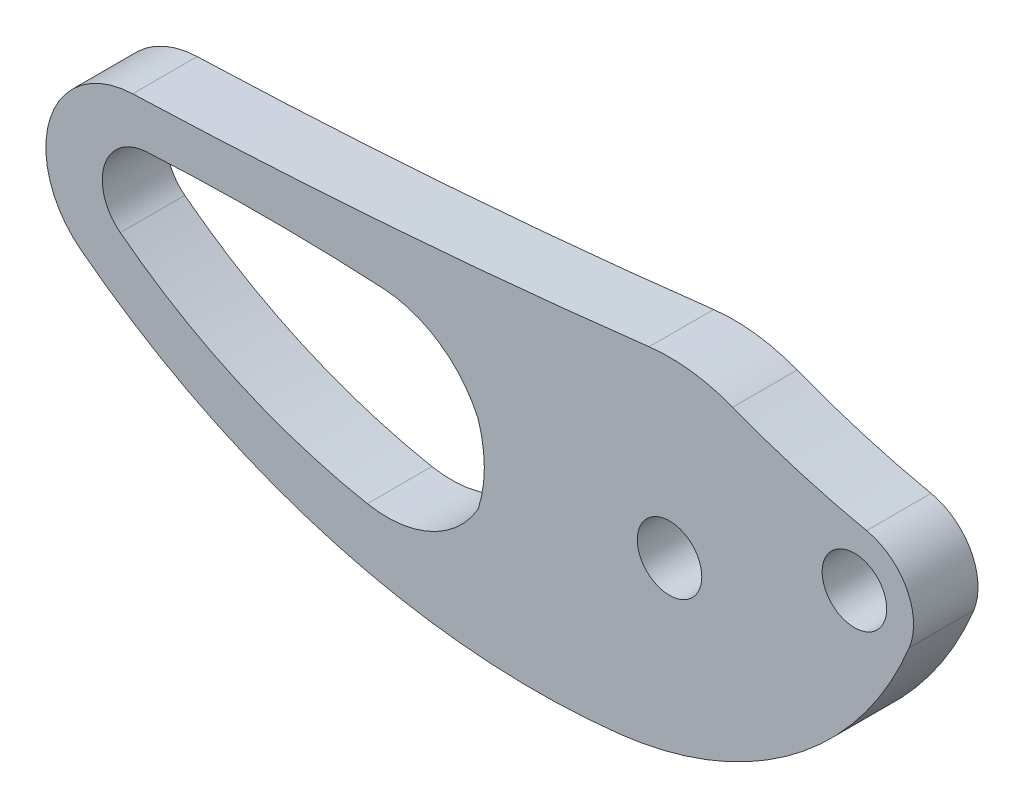
ISO-10303-21;
HEADER;
FILE_DESCRIPTION(('STEP AP214'),'2;1');
FILE_NAME('part.step','',(''),(''),'','','');
FILE_SCHEMA(('AUTOMOTIVE_DESIGN { 1 0 10303 214 1 1 1 1 }'));
ENDSEC;
DATA;
#1=APPLICATION_CONTEXT('core data for automotive mechanical design processes');
#2=APPLICATION_PROTOCOL_DEFINITION('international standard','automotive_design',2000,#1);
#3=PRODUCT_CONTEXT('',#1,'mechanical');
#4=PRODUCT('Part','Part','',(#3));
#5=PRODUCT_RELATED_PRODUCT_CATEGORY('part','',(#4));
#6=PRODUCT_DEFINITION_FORMATION('','',#4);
#7=PRODUCT_DEFINITION_CONTEXT('part definition',#1,'design');
#8=PRODUCT_DEFINITION('design','',#6,#7);
#9=PRODUCT_DEFINITION_SHAPE('','',#8);
#10=(LENGTH_UNIT() NAMED_UNIT(*) SI_UNIT(.MILLI.,.METRE.));
#11=(NAMED_UNIT(*) PLANE_ANGLE_UNIT() SI_UNIT($,.RADIAN.));
#12=(NAMED_UNIT(*) SI_UNIT($,.STERADIAN.) SOLID_ANGLE_UNIT());
#13=UNCERTAINTY_MEASURE_WITH_UNIT(LENGTH_MEASURE(1.E-05),#10,'distance_accuracy_value','');
#14=(GEOMETRIC_REPRESENTATION_CONTEXT(3) GLOBAL_UNCERTAINTY_ASSIGNED_CONTEXT((#13)) GLOBAL_UNIT_ASSIGNED_CONTEXT((#10,
#11,#12)) REPRESENTATION_CONTEXT('',''));
#15=CARTESIAN_POINT('',(0.,0.,0.));
#16=DIRECTION('',(0.,0.,1.));
#17=DIRECTION('',(1.,0.,0.));
#18=AXIS2_PLACEMENT_3D('',#15,#16,#17);
#19=CARTESIAN_POINT('',(-15.5308841395196,14.1350917098286,3.));
#20=DIRECTION('',(0.,0.,1.));
#21=DIRECTION('',(1.,0.,0.));
#22=AXIS2_PLACEMENT_3D('',#19,#20,#21);
#23=PLANE('',#22);
#24=CARTESIAN_POINT('',(0.,0.,3.));
#25=DIRECTION('',(0.,0.,1.));
#26=DIRECTION('',(1.,0.,0.));
#27=AXIS2_PLACEMENT_3D('',#24,#25,#26);
#28=CIRCLE('',#27,1.5);
#29=CARTESIAN_POINT('',(1.5,0.,3.));
#30=VERTEX_POINT('',#29);
#31=EDGE_CURVE('E193',#30,#30,#28,.T.);
#32=ORIENTED_EDGE('',*,*,#31,.F.);
#33=EDGE_LOOP('',(#32));
#34=FACE_BOUND('',#33,.T.);
#35=CARTESIAN_POINT('',(-24.8319884955234,2.03954888143739,3.));
#36=DIRECTION('',(0.,0.,1.));
#37=DIRECTION('',(1.,0.,0.));
#38=AXIS2_PLACEMENT_3D('',#35,#36,#37);
#39=CIRCLE('',#38,4.18039425639633);
#40=CARTESIAN_POINT('',(-24.9740478743966,6.21752868892633,3.));
#41=VERTEX_POINT('',#40);
#42=CARTESIAN_POINT('',(-27.380276013909,-1.27435016086185,3.));
#43=VERTEX_POINT('',#42);
#44=EDGE_CURVE('E199',#41,#43,#39,.T.);
#45=ORIENTED_EDGE('',*,*,#44,.T.);
#46=CARTESIAN_POINT('',(-6.22977978351571,26.2306345382198,3.));
#47=DIRECTION('',(0.,0.,1.));
#48=DIRECTION('',(1.,0.,0.));
#49=AXIS2_PLACEMENT_3D('',#46,#47,#48);
#50=CIRCLE('',#49,34.6967963087169);
#51=CARTESIAN_POINT('',(-2.3390606895117,-8.24732913454005,3.));
#52=VERTEX_POINT('',#51);
#53=EDGE_CURVE('E202',#43,#52,#50,.T.);
#54=ORIENTED_EDGE('',*,*,#53,.T.);
#55=CARTESIAN_POINT('',(-4.1973686650616,8.22023722679113,3.));
#56=DIRECTION('',(0.,0.,1.));
#57=DIRECTION('',(1.,0.,0.));
#58=AXIS2_PLACEMENT_3D('',#55,#56,#57);
#59=CIRCLE('',#58,16.5720864829037);
#60=CARTESIAN_POINT('',(11.147191657554,1.96096259609702,3.));
#61=VERTEX_POINT('',#60);
#62=EDGE_CURVE('E205',#52,#61,#59,.T.);
#63=ORIENTED_EDGE('',*,*,#62,.T.);
#64=CARTESIAN_POINT('',(8.6,3.,3.));
#65=DIRECTION('',(0.,0.,1.));
#66=DIRECTION('',(1.,0.,0.));
#67=AXIS2_PLACEMENT_3D('',#64,#65,#66);
#68=CIRCLE('',#67,2.75096057169527);
#69=CARTESIAN_POINT('',(9.16632252846627,5.69203693525433,3.));
#70=VERTEX_POINT('',#69);
#71=EDGE_CURVE('E207',#61,#70,#68,.T.);
#72=ORIENTED_EDGE('',*,*,#71,.T.);
#73=CARTESIAN_POINT('',(17.3476646448691,44.5823760092716,3.));
#74=DIRECTION('',(0.,0.,-1.));
#75=DIRECTION('',(-1.,0.,0.));
#76=AXIS2_PLACEMENT_3D('',#73,#74,#75);
#77=CIRCLE('',#76,39.7415756119163);
#78=CARTESIAN_POINT('',(2.93620994119707,7.54586962109196,3.));
#79=VERTEX_POINT('',#78);
#80=EDGE_CURVE('E209',#70,#79,#77,.T.);
#81=ORIENTED_EDGE('',*,*,#80,.T.);
#82=CARTESIAN_POINT('',(0.,0.,3.));
#83=DIRECTION('',(0.,0.,1.));
#84=DIRECTION('',(1.,0.,0.));
#85=AXIS2_PLACEMENT_3D('',#82,#83,#84);
#86=CIRCLE('',#85,8.09700420879869);
#87=CARTESIAN_POINT('',(-0.949475558181056,8.04114253832877,3.));
#88=VERTEX_POINT('',#87);
#89=EDGE_CURVE('E211',#79,#88,#86,.T.);
#90=ORIENTED_EDGE('',*,*,#89,.T.);
#91=CARTESIAN_POINT('',(-34.7772091161292,294.529430672017,3.));
#92=DIRECTION('',(0.,0.,-1.));
#93=DIRECTION('',(-1.,0.,0.));
#94=AXIS2_PLACEMENT_3D('',#91,#92,#93);
#95=CIRCLE('',#94,288.478517043191);
#96=EDGE_CURVE('E213',#88,#41,#95,.T.);
#97=ORIENTED_EDGE('',*,*,#96,.T.);
#98=EDGE_LOOP('',(#45,#54,#63,#72,#81,#90,#97));
#99=FACE_BOUND('',#98,.T.);
#100=CARTESIAN_POINT('',(8.6,3.,3.));
#101=DIRECTION('',(0.,0.,1.));
#102=DIRECTION('',(1.,0.,0.));
#103=AXIS2_PLACEMENT_3D('',#100,#101,#102);
#104=CIRCLE('',#103,1.5);
#105=CARTESIAN_POINT('',(10.1,3.,3.));
#106=VERTEX_POINT('',#105);
#107=EDGE_CURVE('E187',#106,#106,#104,.T.);
#108=ORIENTED_EDGE('',*,*,#107,.F.);
#109=EDGE_LOOP('',(#108));
#110=FACE_BOUND('',#109,.T.);
#111=CARTESIAN_POINT('',(-8.96168684271906,21.8324207585978,3.));
#112=DIRECTION('',(0.,0.,1.));
#113=DIRECTION('',(1.,0.,0.));
#114=AXIS2_PLACEMENT_3D('',#111,#112,#113);
#115=CIRCLE('',#114,27.1503349913436);
#116=CARTESIAN_POINT('',(-25.5492022366017,0.338351269553009,3.));
#117=VERTEX_POINT('',#116);
#118=CARTESIAN_POINT('',(-14.0560528446288,-4.83568988277995,3.));
#119=VERTEX_POINT('',#118);
#120=EDGE_CURVE('E144',#117,#119,#115,.T.);
#121=ORIENTED_EDGE('',*,*,#120,.F.);
#122=CARTESIAN_POINT('',(-24.2307407016769,2.04681110680852,3.));
#123=DIRECTION('',(0.,0.,1.));
#124=DIRECTION('',(-1.,0.,0.));
#125=AXIS2_PLACEMENT_3D('',#122,#123,#124);
#126=CIRCLE('',#125,2.15804908067248);
#127=CARTESIAN_POINT('',(-24.3493638937052,4.20159749364697,3.));
#128=VERTEX_POINT('',#127);
#129=EDGE_CURVE('E136',#128,#117,#126,.T.);
#130=ORIENTED_EDGE('',*,*,#129,.F.);
#131=CARTESIAN_POINT('',(-18.8042959294308,-96.524379941401,3.));
#132=DIRECTION('',(0.,0.,1.));
#133=DIRECTION('',(-1.,0.,0.));
#134=AXIS2_PLACEMENT_3D('',#131,#132,#133);
#135=CIRCLE('',#134,100.8784927969);
#136=CARTESIAN_POINT('',(-13.3345642891084,4.205716577748,3.));
#137=VERTEX_POINT('',#136);
#138=EDGE_CURVE('E165',#137,#128,#135,.T.);
#139=ORIENTED_EDGE('',*,*,#138,.F.);
#140=CARTESIAN_POINT('',(-13.614511928909,-0.949774519757408,3.));
#141=DIRECTION('',(0.,0.,1.));
#142=DIRECTION('',(1.,0.,0.));
#143=AXIS2_PLACEMENT_3D('',#140,#141,#142);
#144=CIRCLE('',#143,5.16308620279457);
#145=CARTESIAN_POINT('',(-8.90463517045772,1.16553161829632,3.));
#146=VERTEX_POINT('',#145);
#147=EDGE_CURVE('E163',#146,#137,#144,.T.);
#148=ORIENTED_EDGE('',*,*,#147,.F.);
#149=CARTESIAN_POINT('',(-14.5098051441842,-0.657235742021626,3.));
#150=DIRECTION('',(0.,0.,1.));
#151=DIRECTION('',(1.,0.,0.));
#152=AXIS2_PLACEMENT_3D('',#149,#150,#151);
#153=CIRCLE('',#152,5.89409970090478);
#154=CARTESIAN_POINT('',(-8.90463517045773,-2.48000310233957,3.));
#155=VERTEX_POINT('',#154);
#156=EDGE_CURVE('E159',#155,#146,#153,.T.);
#157=ORIENTED_EDGE('',*,*,#156,.F.);
#158=CARTESIAN_POINT('',(-13.1384094101785,-0.0319877871549591,3.));
#159=DIRECTION('',(0.,0.,1.));
#160=DIRECTION('',(1.,0.,0.));
#161=AXIS2_PLACEMENT_3D('',#158,#159,#160);
#162=CIRCLE('',#161,4.89056472161465);
#163=EDGE_CURVE('E157',#119,#155,#162,.T.);
#164=ORIENTED_EDGE('',*,*,#163,.F.);
#165=EDGE_LOOP('',(#121,#130,#139,#148,#157,#164));
#166=FACE_BOUND('',#165,.T.);
#167=ADVANCED_FACE('F41',(#34,#99,#110,#166),#23,.T.);
#168=CARTESIAN_POINT('',(-15.5308841395196,14.1350917098286,0.));
#169=DIRECTION('',(0.,0.,1.));
#170=DIRECTION('',(1.,0.,0.));
#171=AXIS2_PLACEMENT_3D('',#168,#169,#170);
#172=PLANE('',#171);
#173=CARTESIAN_POINT('',(8.6,3.,0.));
#174=DIRECTION('',(0.,0.,1.));
#175=DIRECTION('',(1.,0.,0.));
#176=AXIS2_PLACEMENT_3D('',#173,#174,#175);
#177=CIRCLE('',#176,1.5);
#178=CARTESIAN_POINT('',(10.1,3.,0.));
#179=VERTEX_POINT('',#178);
#180=EDGE_CURVE('E152',#179,#179,#177,.T.);
#181=ORIENTED_EDGE('',*,*,#180,.T.);
#182=EDGE_LOOP('',(#181));
#183=FACE_BOUND('',#182,.T.);
#184=CARTESIAN_POINT('',(0.,0.,0.));
#185=DIRECTION('',(0.,0.,1.));
#186=DIRECTION('',(1.,0.,0.));
#187=AXIS2_PLACEMENT_3D('',#184,#185,#186);
#188=CIRCLE('',#187,1.5);
#189=CARTESIAN_POINT('',(1.5,0.,0.));
#190=VERTEX_POINT('',#189);
#191=EDGE_CURVE('E190',#190,#190,#188,.T.);
#192=ORIENTED_EDGE('',*,*,#191,.T.);
#193=EDGE_LOOP('',(#192));
#194=FACE_BOUND('',#193,.T.);
#195=CARTESIAN_POINT('',(-24.8319884955234,2.03954888143739,0.));
#196=DIRECTION('',(0.,0.,1.));
#197=DIRECTION('',(1.,0.,0.));
#198=AXIS2_PLACEMENT_3D('',#195,#196,#197);
#199=CIRCLE('',#198,4.18039425639633);
#200=CARTESIAN_POINT('',(-24.9740478743966,6.21752868892633,0.));
#201=VERTEX_POINT('',#200);
#202=CARTESIAN_POINT('',(-27.380276013909,-1.27435016086185,0.));
#203=VERTEX_POINT('',#202);
#204=EDGE_CURVE('E196',#201,#203,#199,.T.);
#205=ORIENTED_EDGE('',*,*,#204,.F.);
#206=CARTESIAN_POINT('',(-34.7772091161292,294.529430672017,0.));
#207=DIRECTION('',(0.,0.,-1.));
#208=DIRECTION('',(-1.,0.,0.));
#209=AXIS2_PLACEMENT_3D('',#206,#207,#208);
#210=CIRCLE('',#209,288.478517043191);
#211=CARTESIAN_POINT('',(-0.949475558181056,8.04114253832877,0.));
#212=VERTEX_POINT('',#211);
#213=EDGE_CURVE('E203',#212,#201,#210,.T.);
#214=ORIENTED_EDGE('',*,*,#213,.F.);
#215=CARTESIAN_POINT('',(0.,0.,0.));
#216=DIRECTION('',(0.,0.,1.));
#217=DIRECTION('',(1.,0.,0.));
#218=AXIS2_PLACEMENT_3D('',#215,#216,#217);
#219=CIRCLE('',#218,8.09700420879869);
#220=CARTESIAN_POINT('',(2.93620994119707,7.54586962109196,0.));
#221=VERTEX_POINT('',#220);
#222=EDGE_CURVE('E226',#221,#212,#219,.T.);
#223=ORIENTED_EDGE('',*,*,#222,.F.);
#224=CARTESIAN_POINT('',(17.3476646448691,44.5823760092716,0.));
#225=DIRECTION('',(0.,0.,-1.));
#226=DIRECTION('',(-1.,0.,0.));
#227=AXIS2_PLACEMENT_3D('',#224,#225,#226);
#228=CIRCLE('',#227,39.7415756119163);
#229=CARTESIAN_POINT('',(9.16632252846627,5.69203693525433,0.));
#230=VERTEX_POINT('',#229);
#231=EDGE_CURVE('E224',#230,#221,#228,.T.);
#232=ORIENTED_EDGE('',*,*,#231,.F.);
#233=CARTESIAN_POINT('',(8.6,3.,0.));
#234=DIRECTION('',(0.,0.,1.));
#235=DIRECTION('',(1.,0.,0.));
#236=AXIS2_PLACEMENT_3D('',#233,#234,#235);
#237=CIRCLE('',#236,2.75096057169527);
#238=CARTESIAN_POINT('',(11.147191657554,1.96096259609702,0.));
#239=VERTEX_POINT('',#238);
#240=EDGE_CURVE('E222',#239,#230,#237,.T.);
#241=ORIENTED_EDGE('',*,*,#240,.F.);
#242=CARTESIAN_POINT('',(-4.1973686650616,8.22023722679113,0.));
#243=DIRECTION('',(0.,0.,1.));
#244=DIRECTION('',(1.,0.,0.));
#245=AXIS2_PLACEMENT_3D('',#242,#243,#244);
#246=CIRCLE('',#245,16.5720864829037);
#247=CARTESIAN_POINT('',(-2.3390606895117,-8.24732913454005,0.));
#248=VERTEX_POINT('',#247);
#249=EDGE_CURVE('E220',#248,#239,#246,.T.);
#250=ORIENTED_EDGE('',*,*,#249,.F.);
#251=CARTESIAN_POINT('',(-6.22977978351571,26.2306345382198,0.));
#252=DIRECTION('',(0.,0.,1.));
#253=DIRECTION('',(1.,0.,0.));
#254=AXIS2_PLACEMENT_3D('',#251,#252,#253);
#255=CIRCLE('',#254,34.6967963087169);
#256=EDGE_CURVE('E218',#203,#248,#255,.T.);
#257=ORIENTED_EDGE('',*,*,#256,.F.);
#258=EDGE_LOOP('',(#205,#214,#223,#232,#241,#250,#257));
#259=FACE_BOUND('',#258,.T.);
#260=CARTESIAN_POINT('',(-24.2307407016769,2.04681110680852,0.));
#261=DIRECTION('',(0.,0.,1.));
#262=DIRECTION('',(-1.,0.,0.));
#263=AXIS2_PLACEMENT_3D('',#260,#261,#262);
#264=CIRCLE('',#263,2.15804908067248);
#265=CARTESIAN_POINT('',(-24.3493638937052,4.20159749364697,0.));
#266=VERTEX_POINT('',#265);
#267=CARTESIAN_POINT('',(-25.5492022366017,0.338351269553009,0.));
#268=VERTEX_POINT('',#267);
#269=EDGE_CURVE('E64',#266,#268,#264,.T.);
#270=ORIENTED_EDGE('',*,*,#269,.T.);
#271=CARTESIAN_POINT('',(-8.96168684271906,21.8324207585978,0.));
#272=DIRECTION('',(0.,0.,1.));
#273=DIRECTION('',(1.,0.,0.));
#274=AXIS2_PLACEMENT_3D('',#271,#272,#273);
#275=CIRCLE('',#274,27.1503349913436);
#276=CARTESIAN_POINT('',(-14.0560528446288,-4.83568988277995,0.));
#277=VERTEX_POINT('',#276);
#278=EDGE_CURVE('E151',#268,#277,#275,.T.);
#279=ORIENTED_EDGE('',*,*,#278,.T.);
#280=CARTESIAN_POINT('',(-13.1384094101785,-0.0319877871549591,0.));
#281=DIRECTION('',(0.,0.,1.));
#282=DIRECTION('',(1.,0.,0.));
#283=AXIS2_PLACEMENT_3D('',#280,#281,#282);
#284=CIRCLE('',#283,4.89056472161465);
#285=CARTESIAN_POINT('',(-8.90463517045773,-2.48000310233957,0.));
#286=VERTEX_POINT('',#285);
#287=EDGE_CURVE('E169',#277,#286,#284,.T.);
#288=ORIENTED_EDGE('',*,*,#287,.T.);
#289=CARTESIAN_POINT('',(-14.5098051441842,-0.657235742021626,0.));
#290=DIRECTION('',(0.,0.,1.));
#291=DIRECTION('',(1.,0.,0.));
#292=AXIS2_PLACEMENT_3D('',#289,#290,#291);
#293=CIRCLE('',#292,5.89409970090478);
#294=CARTESIAN_POINT('',(-8.90463517045772,1.16553161829632,0.));
#295=VERTEX_POINT('',#294);
#296=EDGE_CURVE('E172',#286,#295,#293,.T.);
#297=ORIENTED_EDGE('',*,*,#296,.T.);
#298=CARTESIAN_POINT('',(-13.614511928909,-0.949774519757408,0.));
#299=DIRECTION('',(0.,0.,1.));
#300=DIRECTION('',(1.,0.,0.));
#301=AXIS2_PLACEMENT_3D('',#298,#299,#300);
#302=CIRCLE('',#301,5.16308620279457);
#303=CARTESIAN_POINT('',(-13.3345642891084,4.20571657774802,0.));
#304=VERTEX_POINT('',#303);
#305=EDGE_CURVE('E175',#295,#304,#302,.T.);
#306=ORIENTED_EDGE('',*,*,#305,.T.);
#307=CARTESIAN_POINT('',(-18.8042959294308,-96.524379941401,0.));
#308=DIRECTION('',(0.,0.,1.));
#309=DIRECTION('',(-1.,0.,0.));
#310=AXIS2_PLACEMENT_3D('',#307,#308,#309);
#311=CIRCLE('',#310,100.8784927969);
#312=EDGE_CURVE('E145',#304,#266,#311,.T.);
#313=ORIENTED_EDGE('',*,*,#312,.T.);
#314=EDGE_LOOP('',(#270,#279,#288,#297,#306,#313));
#315=FACE_BOUND('',#314,.T.);
#316=ADVANCED_FACE('F253',(#183,#194,#259,#315),#172,.F.);
#317=CARTESIAN_POINT('',(-24.8319884955234,2.03954888143739,3.));
#318=DIRECTION('',(0.,0.,-1.));
#319=DIRECTION('',(-1.,0.,0.));
#320=AXIS2_PLACEMENT_3D('',#317,#318,#319);
#321=CYLINDRICAL_SURFACE('',#320,4.18039425639633);
#322=ORIENTED_EDGE('',*,*,#204,.T.);
#323=DIRECTION('',(0.,0.,-1.));
#324=VECTOR('',#323,1.);
#325=CARTESIAN_POINT('',(-27.380276013909,-1.27435016086185,3.));
#326=LINE('',#325,#324);
#327=EDGE_CURVE('E11',#43,#203,#326,.T.);
#328=ORIENTED_EDGE('',*,*,#327,.F.);
#329=ORIENTED_EDGE('',*,*,#44,.F.);
#330=DIRECTION('',(0.,0.,-1.));
#331=VECTOR('',#330,1.);
#332=CARTESIAN_POINT('',(-24.9740478743966,6.21752868892633,3.));
#333=LINE('',#332,#331);
#334=EDGE_CURVE('E215',#41,#201,#333,.T.);
#335=ORIENTED_EDGE('',*,*,#334,.T.);
#336=EDGE_LOOP('',(#322,#328,#329,#335));
#337=FACE_BOUND('',#336,.T.);
#338=ADVANCED_FACE('F43',(#337),#321,.T.);
#339=CARTESIAN_POINT('',(-6.22977978351571,26.2306345382198,3.));
#340=DIRECTION('',(0.,0.,-1.));
#341=DIRECTION('',(-1.,0.,0.));
#342=AXIS2_PLACEMENT_3D('',#339,#340,#341);
#343=CYLINDRICAL_SURFACE('',#342,34.6967963087169);
#344=ORIENTED_EDGE('',*,*,#256,.T.);
#345=DIRECTION('',(0.,0.,-1.));
#346=VECTOR('',#345,1.);
#347=CARTESIAN_POINT('',(-2.3390606895117,-8.24732913454005,3.));
#348=LINE('',#347,#346);
#349=EDGE_CURVE('E49',#52,#248,#348,.T.);
#350=ORIENTED_EDGE('',*,*,#349,.F.);
#351=ORIENTED_EDGE('',*,*,#53,.F.);
#352=ORIENTED_EDGE('',*,*,#327,.T.);
#353=EDGE_LOOP('',(#344,#350,#351,#352));
#354=FACE_BOUND('',#353,.T.);
#355=ADVANCED_FACE('F271',(#354),#343,.T.);
#356=CARTESIAN_POINT('',(-4.1973686650616,8.22023722679113,3.));
#357=DIRECTION('',(0.,0.,-1.));
#358=DIRECTION('',(-1.,0.,0.));
#359=AXIS2_PLACEMENT_3D('',#356,#357,#358);
#360=CYLINDRICAL_SURFACE('',#359,16.5720864829037);
#361=ORIENTED_EDGE('',*,*,#249,.T.);
#362=DIRECTION('',(0.,0.,-1.));
#363=VECTOR('',#362,1.);
#364=CARTESIAN_POINT('',(11.147191657554,1.96096259609702,3.));
#365=LINE('',#364,#363);
#366=EDGE_CURVE('E240',#61,#239,#365,.T.);
#367=ORIENTED_EDGE('',*,*,#366,.F.);
#368=ORIENTED_EDGE('',*,*,#62,.F.);
#369=ORIENTED_EDGE('',*,*,#349,.T.);
#370=EDGE_LOOP('',(#361,#367,#368,#369));
#371=FACE_BOUND('',#370,.T.);
#372=ADVANCED_FACE('F247',(#371),#360,.T.);
#373=CARTESIAN_POINT('',(8.6,3.,3.));
#374=DIRECTION('',(0.,0.,-1.));
#375=DIRECTION('',(-1.,0.,0.));
#376=AXIS2_PLACEMENT_3D('',#373,#374,#375);
#377=CYLINDRICAL_SURFACE('',#376,2.75096057169527);
#378=ORIENTED_EDGE('',*,*,#240,.T.);
#379=DIRECTION('',(0.,0.,-1.));
#380=VECTOR('',#379,1.);
#381=CARTESIAN_POINT('',(9.16632252846627,5.69203693525433,3.));
#382=LINE('',#381,#380);
#383=EDGE_CURVE('E237',#70,#230,#382,.T.);
#384=ORIENTED_EDGE('',*,*,#383,.F.);
#385=ORIENTED_EDGE('',*,*,#71,.F.);
#386=ORIENTED_EDGE('',*,*,#366,.T.);
#387=EDGE_LOOP('',(#378,#384,#385,#386));
#388=FACE_BOUND('',#387,.T.);
#389=ADVANCED_FACE('F259',(#388),#377,.T.);
#390=CARTESIAN_POINT('',(17.3476646448691,44.5823760092716,3.));
#391=DIRECTION('',(0.,0.,-1.));
#392=DIRECTION('',(-1.,0.,0.));
#393=AXIS2_PLACEMENT_3D('',#390,#391,#392);
#394=CYLINDRICAL_SURFACE('',#393,39.7415756119163);
#395=ORIENTED_EDGE('',*,*,#231,.T.);
#396=DIRECTION('',(0.,0.,-1.));
#397=VECTOR('',#396,1.);
#398=CARTESIAN_POINT('',(2.93620994119707,7.54586962109196,3.));
#399=LINE('',#398,#397);
#400=EDGE_CURVE('E234',#79,#221,#399,.T.);
#401=ORIENTED_EDGE('',*,*,#400,.F.);
#402=ORIENTED_EDGE('',*,*,#80,.F.);
#403=ORIENTED_EDGE('',*,*,#383,.T.);
#404=EDGE_LOOP('',(#395,#401,#402,#403));
#405=FACE_BOUND('',#404,.T.);
#406=ADVANCED_FACE('F263',(#405),#394,.F.);
#407=CARTESIAN_POINT('',(0.,0.,3.));
#408=DIRECTION('',(0.,0.,-1.));
#409=DIRECTION('',(-1.,0.,0.));
#410=AXIS2_PLACEMENT_3D('',#407,#408,#409);
#411=CYLINDRICAL_SURFACE('',#410,8.09700420879869);
#412=ORIENTED_EDGE('',*,*,#222,.T.);
#413=DIRECTION('',(0.,0.,-1.));
#414=VECTOR('',#413,1.);
#415=CARTESIAN_POINT('',(-0.949475558181056,8.04114253832877,3.));
#416=LINE('',#415,#414);
#417=EDGE_CURVE('E231',#88,#212,#416,.T.);
#418=ORIENTED_EDGE('',*,*,#417,.F.);
#419=ORIENTED_EDGE('',*,*,#89,.F.);
#420=ORIENTED_EDGE('',*,*,#400,.T.);
#421=EDGE_LOOP('',(#412,#418,#419,#420));
#422=FACE_BOUND('',#421,.T.);
#423=ADVANCED_FACE('F279',(#422),#411,.T.);
#424=CARTESIAN_POINT('',(-34.7772091161292,294.529430672017,3.));
#425=DIRECTION('',(0.,0.,-1.));
#426=DIRECTION('',(-1.,0.,0.));
#427=AXIS2_PLACEMENT_3D('',#424,#425,#426);
#428=CYLINDRICAL_SURFACE('',#427,288.478517043191);
#429=ORIENTED_EDGE('',*,*,#213,.T.);
#430=ORIENTED_EDGE('',*,*,#334,.F.);
#431=ORIENTED_EDGE('',*,*,#96,.F.);
#432=ORIENTED_EDGE('',*,*,#417,.T.);
#433=EDGE_LOOP('',(#429,#430,#431,#432));
#434=FACE_BOUND('',#433,.T.);
#435=ADVANCED_FACE('F276',(#434),#428,.F.);
#436=CARTESIAN_POINT('',(0.,0.,3.));
#437=DIRECTION('',(0.,0.,-1.));
#438=DIRECTION('',(-1.,0.,0.));
#439=AXIS2_PLACEMENT_3D('',#436,#437,#438);
#440=CYLINDRICAL_SURFACE('',#439,1.5);
#441=ORIENTED_EDGE('',*,*,#31,.T.);
#442=EDGE_LOOP('',(#441));
#443=FACE_BOUND('',#442,.T.);
#444=ORIENTED_EDGE('',*,*,#191,.F.);
#445=EDGE_LOOP('',(#444));
#446=FACE_BOUND('',#445,.T.);
#447=ADVANCED_FACE('F286',(#443,#446),#440,.F.);
#448=CARTESIAN_POINT('',(8.6,3.,3.));
#449=DIRECTION('',(0.,0.,-1.));
#450=DIRECTION('',(-1.,0.,0.));
#451=AXIS2_PLACEMENT_3D('',#448,#449,#450);
#452=CYLINDRICAL_SURFACE('',#451,1.5);
#453=ORIENTED_EDGE('',*,*,#107,.T.);
#454=EDGE_LOOP('',(#453));
#455=FACE_BOUND('',#454,.T.);
#456=ORIENTED_EDGE('',*,*,#180,.F.);
#457=EDGE_LOOP('',(#456));
#458=FACE_BOUND('',#457,.T.);
#459=ADVANCED_FACE('F301',(#455,#458),#452,.F.);
#460=CARTESIAN_POINT('',(-24.2307407016769,2.04681110680852,3.));
#461=DIRECTION('',(0.,0.,-1.));
#462=DIRECTION('',(-1.,0.,0.));
#463=AXIS2_PLACEMENT_3D('',#460,#461,#462);
#464=CYLINDRICAL_SURFACE('',#463,2.15804908067248);
#465=ORIENTED_EDGE('',*,*,#269,.F.);
#466=DIRECTION('',(0.,0.,-1.));
#467=VECTOR('',#466,1.);
#468=CARTESIAN_POINT('',(-24.3493638937052,4.20159749364697,3.));
#469=LINE('',#468,#467);
#470=EDGE_CURVE('E140',#128,#266,#469,.T.);
#471=ORIENTED_EDGE('',*,*,#470,.F.);
#472=ORIENTED_EDGE('',*,*,#129,.T.);
#473=DIRECTION('',(0.,0.,-1.));
#474=VECTOR('',#473,1.);
#475=CARTESIAN_POINT('',(-25.5492022366017,0.338351269553009,3.));
#476=LINE('',#475,#474);
#477=EDGE_CURVE('E139',#117,#268,#476,.T.);
#478=ORIENTED_EDGE('',*,*,#477,.T.);
#479=EDGE_LOOP('',(#465,#471,#472,#478));
#480=FACE_BOUND('',#479,.T.);
#481=ADVANCED_FACE('F138',(#480),#464,.F.);
#482=CARTESIAN_POINT('',(-8.96168684271906,21.8324207585978,3.));
#483=DIRECTION('',(0.,0.,-1.));
#484=DIRECTION('',(-1.,0.,0.));
#485=AXIS2_PLACEMENT_3D('',#482,#483,#484);
#486=CYLINDRICAL_SURFACE('',#485,27.1503349913436);
#487=ORIENTED_EDGE('',*,*,#278,.F.);
#488=ORIENTED_EDGE('',*,*,#477,.F.);
#489=ORIENTED_EDGE('',*,*,#120,.T.);
#490=DIRECTION('',(0.,0.,-1.));
#491=VECTOR('',#490,1.);
#492=CARTESIAN_POINT('',(-14.0560528446288,-4.83568988277995,3.));
#493=LINE('',#492,#491);
#494=EDGE_CURVE('E153',#119,#277,#493,.T.);
#495=ORIENTED_EDGE('',*,*,#494,.T.);
#496=EDGE_LOOP('',(#487,#488,#489,#495));
#497=FACE_BOUND('',#496,.T.);
#498=ADVANCED_FACE('F148',(#497),#486,.F.);
#499=CARTESIAN_POINT('',(-13.1384094101785,-0.0319877871549591,3.));
#500=DIRECTION('',(0.,0.,-1.));
#501=DIRECTION('',(-1.,0.,0.));
#502=AXIS2_PLACEMENT_3D('',#499,#500,#501);
#503=CYLINDRICAL_SURFACE('',#502,4.89056472161465);
#504=ORIENTED_EDGE('',*,*,#287,.F.);
#505=ORIENTED_EDGE('',*,*,#494,.F.);
#506=ORIENTED_EDGE('',*,*,#163,.T.);
#507=DIRECTION('',(0.,0.,-1.));
#508=VECTOR('',#507,1.);
#509=CARTESIAN_POINT('',(-8.90463517045773,-2.48000310233957,3.));
#510=LINE('',#509,#508);
#511=EDGE_CURVE('E184',#155,#286,#510,.T.);
#512=ORIENTED_EDGE('',*,*,#511,.T.);
#513=EDGE_LOOP('',(#504,#505,#506,#512));
#514=FACE_BOUND('',#513,.T.);
#515=ADVANCED_FACE('F310',(#514),#503,.F.);
#516=CARTESIAN_POINT('',(-14.5098051441842,-0.657235742021626,3.));
#517=DIRECTION('',(0.,0.,-1.));
#518=DIRECTION('',(-1.,0.,0.));
#519=AXIS2_PLACEMENT_3D('',#516,#517,#518);
#520=CYLINDRICAL_SURFACE('',#519,5.89409970090478);
#521=ORIENTED_EDGE('',*,*,#296,.F.);
#522=ORIENTED_EDGE('',*,*,#511,.F.);
#523=ORIENTED_EDGE('',*,*,#156,.T.);
#524=DIRECTION('',(0.,0.,-1.));
#525=VECTOR('',#524,1.);
#526=CARTESIAN_POINT('',(-8.90463517045772,1.16553161829632,3.));
#527=LINE('',#526,#525);
#528=EDGE_CURVE('E182',#146,#295,#527,.T.);
#529=ORIENTED_EDGE('',*,*,#528,.T.);
#530=EDGE_LOOP('',(#521,#522,#523,#529));
#531=FACE_BOUND('',#530,.T.);
#532=ADVANCED_FACE('F313',(#531),#520,.F.);
#533=CARTESIAN_POINT('',(-13.614511928909,-0.949774519757408,3.));
#534=DIRECTION('',(0.,0.,-1.));
#535=DIRECTION('',(-1.,0.,0.));
#536=AXIS2_PLACEMENT_3D('',#533,#534,#535);
#537=CYLINDRICAL_SURFACE('',#536,5.16308620279457);
#538=ORIENTED_EDGE('',*,*,#305,.F.);
#539=ORIENTED_EDGE('',*,*,#528,.F.);
#540=ORIENTED_EDGE('',*,*,#147,.T.);
#541=DIRECTION('',(0.,0.,-1.));
#542=VECTOR('',#541,1.);
#543=CARTESIAN_POINT('',(-13.3345642891084,4.20571657774802,3.));
#544=LINE('',#543,#542);
#545=EDGE_CURVE('E56',#137,#304,#544,.T.);
#546=ORIENTED_EDGE('',*,*,#545,.T.);
#547=EDGE_LOOP('',(#538,#539,#540,#546));
#548=FACE_BOUND('',#547,.T.);
#549=ADVANCED_FACE('F317',(#548),#537,.F.);
#550=CARTESIAN_POINT('',(-18.8042959294308,-96.524379941401,3.));
#551=DIRECTION('',(0.,0.,-1.));
#552=DIRECTION('',(-1.,0.,0.));
#553=AXIS2_PLACEMENT_3D('',#550,#551,#552);
#554=CYLINDRICAL_SURFACE('',#553,100.8784927969);
#555=ORIENTED_EDGE('',*,*,#312,.F.);
#556=ORIENTED_EDGE('',*,*,#545,.F.);
#557=ORIENTED_EDGE('',*,*,#138,.T.);
#558=ORIENTED_EDGE('',*,*,#470,.T.);
#559=EDGE_LOOP('',(#555,#556,#557,#558));
#560=FACE_BOUND('',#559,.T.);
#561=ADVANCED_FACE('F321',(#560),#554,.F.);
#562=CLOSED_SHELL('',(#167,#316,#338,#355,#372,#389,#406,#423,#435,#447,#459,#481,#498,#515,
#532,#549,#561));
#563=MANIFOLD_SOLID_BREP('B2',#562);
#564=ADVANCED_BREP_SHAPE_REPRESENTATION('',(#18,#563),#14);
#565=SHAPE_DEFINITION_REPRESENTATION(#9,#564);
ENDSEC;
END-ISO-10303-21;
